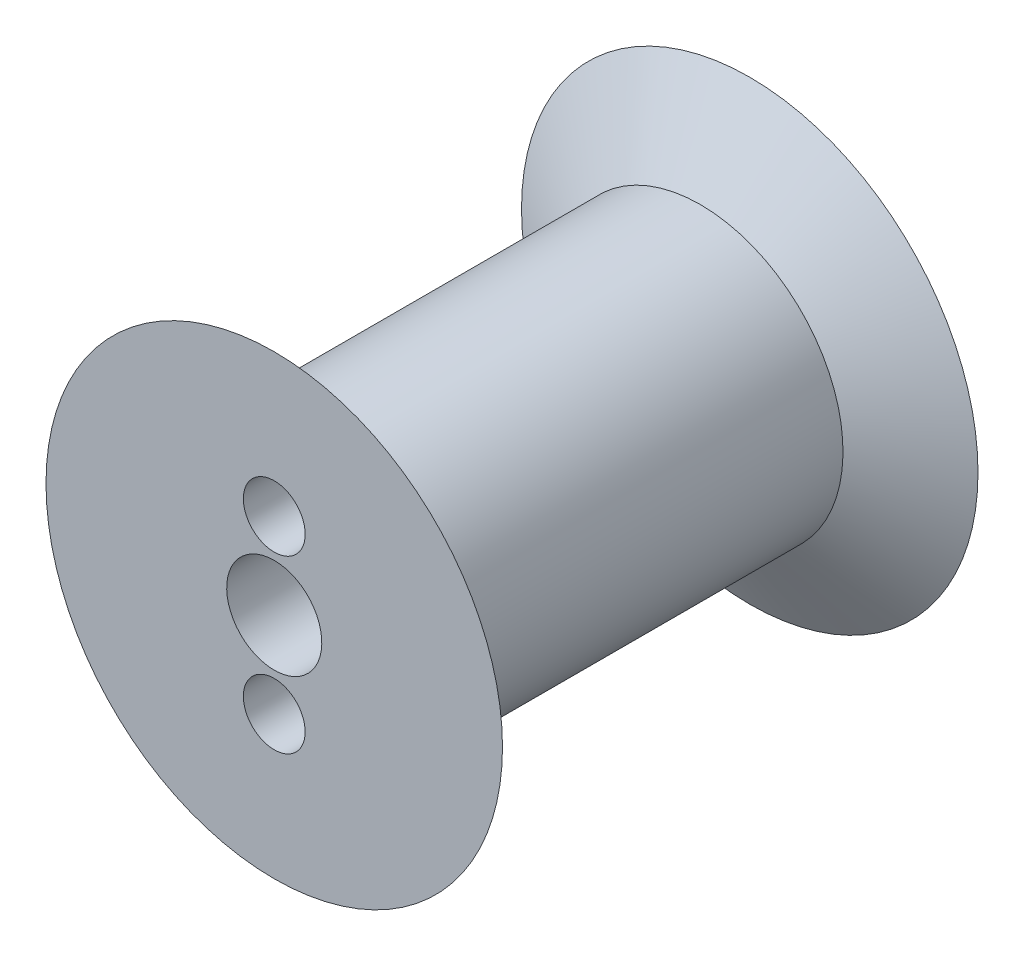
ISO-10303-21;
HEADER;
FILE_DESCRIPTION(('STEP AP214'),'2;1');
FILE_NAME('part.step','',(''),(''),'','','');
FILE_SCHEMA(('AUTOMOTIVE_DESIGN { 1 0 10303 214 1 1 1 1 }'));
ENDSEC;
DATA;
#1=APPLICATION_CONTEXT('core data for automotive mechanical design processes');
#2=APPLICATION_PROTOCOL_DEFINITION('international standard','automotive_design',2000,#1);
#3=PRODUCT_CONTEXT('',#1,'mechanical');
#4=PRODUCT('Part','Part','',(#3));
#5=PRODUCT_RELATED_PRODUCT_CATEGORY('part','',(#4));
#6=PRODUCT_DEFINITION_FORMATION('','',#4);
#7=PRODUCT_DEFINITION_CONTEXT('part definition',#1,'design');
#8=PRODUCT_DEFINITION('design','',#6,#7);
#9=PRODUCT_DEFINITION_SHAPE('','',#8);
#10=(LENGTH_UNIT() NAMED_UNIT(*) SI_UNIT(.MILLI.,.METRE.));
#11=(NAMED_UNIT(*) PLANE_ANGLE_UNIT() SI_UNIT($,.RADIAN.));
#12=(NAMED_UNIT(*) SI_UNIT($,.STERADIAN.) SOLID_ANGLE_UNIT());
#13=UNCERTAINTY_MEASURE_WITH_UNIT(LENGTH_MEASURE(1.E-05),#10,'distance_accuracy_value','');
#14=(GEOMETRIC_REPRESENTATION_CONTEXT(3) GLOBAL_UNCERTAINTY_ASSIGNED_CONTEXT((#13)) GLOBAL_UNIT_ASSIGNED_CONTEXT((#10,
#11,#12)) REPRESENTATION_CONTEXT('',''));
#15=CARTESIAN_POINT('',(0.,0.,0.));
#16=DIRECTION('',(0.,0.,1.));
#17=DIRECTION('',(1.,0.,0.));
#18=AXIS2_PLACEMENT_3D('',#15,#16,#17);
#19=CARTESIAN_POINT('',(-24.,-3.40005076182853E-13,0.));
#20=DIRECTION('',(0.,0.,1.));
#21=DIRECTION('',(0.,-1.,0.));
#22=AXIS2_PLACEMENT_3D('',#19,#20,#21);
#23=PLANE('',#22);
#24=CARTESIAN_POINT('',(0.,-8.99999999999995,0.));
#25=DIRECTION('',(0.,0.,1.));
#26=DIRECTION('',(0.,-1.,0.));
#27=AXIS2_PLACEMENT_3D('',#24,#25,#26);
#28=CIRCLE('',#27,1.69999999999999);
#29=CARTESIAN_POINT('',(0.,-10.6999999999999,0.));
#30=VERTEX_POINT('',#29);
#31=EDGE_CURVE('E68',#30,#30,#28,.T.);
#32=ORIENTED_EDGE('',*,*,#31,.T.);
#33=EDGE_LOOP('',(#32));
#34=FACE_BOUND('',#33,.T.);
#35=CARTESIAN_POINT('',(0.,8.99999999999995,0.));
#36=DIRECTION('',(0.,0.,1.));
#37=DIRECTION('',(0.,-1.,0.));
#38=AXIS2_PLACEMENT_3D('',#35,#36,#37);
#39=CIRCLE('',#38,1.69999999999999);
#40=CARTESIAN_POINT('',(0.,7.29999999999996,0.));
#41=VERTEX_POINT('',#40);
#42=EDGE_CURVE('E56',#41,#41,#39,.T.);
#43=ORIENTED_EDGE('',*,*,#42,.T.);
#44=EDGE_LOOP('',(#43));
#45=FACE_BOUND('',#44,.T.);
#46=CARTESIAN_POINT('',(0.,0.,0.));
#47=DIRECTION('',(0.,0.,-1.));
#48=DIRECTION('',(0.,1.,0.));
#49=AXIS2_PLACEMENT_3D('',#46,#47,#48);
#50=CIRCLE('',#49,5.00000000000006);
#51=CARTESIAN_POINT('',(0.,5.00000000000006,0.));
#52=VERTEX_POINT('',#51);
#53=EDGE_CURVE('E10',#52,#52,#50,.T.);
#54=ORIENTED_EDGE('',*,*,#53,.F.);
#55=EDGE_LOOP('',(#54));
#56=FACE_BOUND('',#55,.T.);
#57=CARTESIAN_POINT('',(0.,0.,0.));
#58=DIRECTION('',(0.,0.,-1.));
#59=DIRECTION('',(0.,1.,0.));
#60=AXIS2_PLACEMENT_3D('',#57,#58,#59);
#61=CIRCLE('',#60,24.0000000000001);
#62=CARTESIAN_POINT('',(0.,24.0000000000001,0.));
#63=VERTEX_POINT('',#62);
#64=EDGE_CURVE('E53',#63,#63,#61,.T.);
#65=ORIENTED_EDGE('',*,*,#64,.T.);
#66=EDGE_LOOP('',(#65));
#67=FACE_BOUND('',#66,.T.);
#68=ADVANCED_FACE('F31',(#34,#45,#56,#67),#23,.F.);
#69=CARTESIAN_POINT('',(0.,0.,0.));
#70=DIRECTION('',(0.,0.,-1.));
#71=DIRECTION('',(0.,1.,0.));
#72=AXIS2_PLACEMENT_3D('',#69,#70,#71);
#73=CYLINDRICAL_SURFACE('',#72,5.00000000000006);
#74=CARTESIAN_POINT('',(0.,0.,50.));
#75=DIRECTION('',(0.,0.,-1.));
#76=DIRECTION('',(0.,1.,0.));
#77=AXIS2_PLACEMENT_3D('',#74,#75,#76);
#78=CIRCLE('',#77,5.00000000000006);
#79=CARTESIAN_POINT('',(0.,5.00000000000006,50.));
#80=VERTEX_POINT('',#79);
#81=EDGE_CURVE('E37',#80,#80,#78,.T.);
#82=ORIENTED_EDGE('',*,*,#81,.F.);
#83=EDGE_LOOP('',(#82));
#84=FACE_BOUND('',#83,.T.);
#85=ORIENTED_EDGE('',*,*,#53,.T.);
#86=EDGE_LOOP('',(#85));
#87=FACE_BOUND('',#86,.T.);
#88=ADVANCED_FACE('F87',(#84,#87),#73,.F.);
#89=CARTESIAN_POINT('',(-5.00000000000001,0.,50.));
#90=DIRECTION('',(0.,0.,-1.));
#91=DIRECTION('',(0.,1.,0.));
#92=AXIS2_PLACEMENT_3D('',#89,#90,#91);
#93=PLANE('',#92);
#94=CARTESIAN_POINT('',(0.,-8.99999999999995,50.));
#95=DIRECTION('',(0.,0.,1.));
#96=DIRECTION('',(1.,0.,0.));
#97=AXIS2_PLACEMENT_3D('',#94,#95,#96);
#98=CIRCLE('',#97,3.25);
#99=CARTESIAN_POINT('',(3.24999999999999,-8.99999999999995,50.));
#100=VERTEX_POINT('',#99);
#101=EDGE_CURVE('E77',#100,#100,#98,.T.);
#102=ORIENTED_EDGE('',*,*,#101,.F.);
#103=EDGE_LOOP('',(#102));
#104=FACE_BOUND('',#103,.T.);
#105=CARTESIAN_POINT('',(0.,8.99999999999995,50.));
#106=DIRECTION('',(0.,0.,1.));
#107=DIRECTION('',(1.,0.,0.));
#108=AXIS2_PLACEMENT_3D('',#105,#106,#107);
#109=CIRCLE('',#108,3.25);
#110=CARTESIAN_POINT('',(3.24999999999999,8.99999999999995,50.));
#111=VERTEX_POINT('',#110);
#112=EDGE_CURVE('E65',#111,#111,#109,.T.);
#113=ORIENTED_EDGE('',*,*,#112,.F.);
#114=EDGE_LOOP('',(#113));
#115=FACE_BOUND('',#114,.T.);
#116=CARTESIAN_POINT('',(0.,0.,50.));
#117=DIRECTION('',(0.,0.,-1.));
#118=DIRECTION('',(0.,1.,0.));
#119=AXIS2_PLACEMENT_3D('',#116,#117,#118);
#120=CIRCLE('',#119,24.0000000000001);
#121=CARTESIAN_POINT('',(0.,24.0000000000001,50.));
#122=VERTEX_POINT('',#121);
#123=EDGE_CURVE('E41',#122,#122,#120,.T.);
#124=ORIENTED_EDGE('',*,*,#123,.F.);
#125=EDGE_LOOP('',(#124));
#126=FACE_BOUND('',#125,.T.);
#127=ORIENTED_EDGE('',*,*,#81,.T.);
#128=EDGE_LOOP('',(#127));
#129=FACE_BOUND('',#128,.T.);
#130=ADVANCED_FACE('F83',(#104,#115,#126,#129),#93,.F.);
#131=CARTESIAN_POINT('',(0.,0.,50.));
#132=DIRECTION('',(0.,0.,1.));
#133=DIRECTION('',(0.,-1.,0.));
#134=AXIS2_PLACEMENT_3D('',#131,#132,#133);
#135=CONICAL_SURFACE('',#134,24.0000000000001,1.0471975511966);
#136=CARTESIAN_POINT('',(0.,0.,44.8038475772934));
#137=DIRECTION('',(0.,0.,-1.));
#138=DIRECTION('',(0.,1.,0.));
#139=AXIS2_PLACEMENT_3D('',#136,#137,#138);
#140=CIRCLE('',#139,15.0000000000001);
#141=CARTESIAN_POINT('',(0.,15.0000000000001,44.8038475772934));
#142=VERTEX_POINT('',#141);
#143=EDGE_CURVE('E45',#142,#142,#140,.T.);
#144=ORIENTED_EDGE('',*,*,#143,.F.);
#145=EDGE_LOOP('',(#144));
#146=FACE_BOUND('',#145,.T.);
#147=ORIENTED_EDGE('',*,*,#123,.T.);
#148=EDGE_LOOP('',(#147));
#149=FACE_BOUND('',#148,.T.);
#150=ADVANCED_FACE('F86',(#146,#149),#135,.T.);
#151=CARTESIAN_POINT('',(0.,0.,0.));
#152=DIRECTION('',(0.,0.,-1.));
#153=DIRECTION('',(0.,1.,0.));
#154=AXIS2_PLACEMENT_3D('',#151,#152,#153);
#155=CYLINDRICAL_SURFACE('',#154,15.0000000000001);
#156=CARTESIAN_POINT('',(0.,0.,5.19615242270656));
#157=DIRECTION('',(0.,0.,-1.));
#158=DIRECTION('',(0.,1.,0.));
#159=AXIS2_PLACEMENT_3D('',#156,#157,#158);
#160=CIRCLE('',#159,15.0000000000001);
#161=CARTESIAN_POINT('',(0.,15.0000000000001,5.19615242270656));
#162=VERTEX_POINT('',#161);
#163=EDGE_CURVE('E50',#162,#162,#160,.T.);
#164=ORIENTED_EDGE('',*,*,#163,.F.);
#165=EDGE_LOOP('',(#164));
#166=FACE_BOUND('',#165,.T.);
#167=ORIENTED_EDGE('',*,*,#143,.T.);
#168=EDGE_LOOP('',(#167));
#169=FACE_BOUND('',#168,.T.);
#170=ADVANCED_FACE('F94',(#166,#169),#155,.T.);
#171=CARTESIAN_POINT('',(0.,0.,5.19615242270656));
#172=DIRECTION('',(0.,0.,-1.));
#173=DIRECTION('',(0.,1.,0.));
#174=AXIS2_PLACEMENT_3D('',#171,#172,#173);
#175=CONICAL_SURFACE('',#174,15.0000000000001,1.0471975511966);
#176=ORIENTED_EDGE('',*,*,#64,.F.);
#177=EDGE_LOOP('',(#176));
#178=FACE_BOUND('',#177,.T.);
#179=ORIENTED_EDGE('',*,*,#163,.T.);
#180=EDGE_LOOP('',(#179));
#181=FACE_BOUND('',#180,.T.);
#182=ADVANCED_FACE('F100',(#178,#181),#175,.T.);
#183=CARTESIAN_POINT('',(0.,8.99999999999995,50.));
#184=DIRECTION('',(0.,0.,1.));
#185=DIRECTION('',(1.,0.,0.));
#186=AXIS2_PLACEMENT_3D('',#183,#184,#185);
#187=CYLINDRICAL_SURFACE('',#186,1.69999999999999);
#188=ORIENTED_EDGE('',*,*,#42,.F.);
#189=EDGE_LOOP('',(#188));
#190=FACE_BOUND('',#189,.T.);
#191=CARTESIAN_POINT('',(0.,8.99999999999995,10.));
#192=DIRECTION('',(0.,0.,1.));
#193=DIRECTION('',(1.,0.,0.));
#194=AXIS2_PLACEMENT_3D('',#191,#192,#193);
#195=CIRCLE('',#194,1.69999999999999);
#196=CARTESIAN_POINT('',(1.69999999999998,8.99999999999995,10.));
#197=VERTEX_POINT('',#196);
#198=EDGE_CURVE('E59',#197,#197,#195,.T.);
#199=ORIENTED_EDGE('',*,*,#198,.T.);
#200=EDGE_LOOP('',(#199));
#201=FACE_BOUND('',#200,.T.);
#202=ADVANCED_FACE('F119',(#190,#201),#187,.F.);
#203=CARTESIAN_POINT('',(1.69999999999998,8.99999999999995,10.));
#204=DIRECTION('',(0.,0.,-1.));
#205=DIRECTION('',(-1.,0.,0.));
#206=AXIS2_PLACEMENT_3D('',#203,#204,#205);
#207=PLANE('',#206);
#208=ORIENTED_EDGE('',*,*,#198,.F.);
#209=EDGE_LOOP('',(#208));
#210=FACE_BOUND('',#209,.T.);
#211=CARTESIAN_POINT('',(0.,8.99999999999995,10.));
#212=DIRECTION('',(0.,0.,1.));
#213=DIRECTION('',(1.,0.,0.));
#214=AXIS2_PLACEMENT_3D('',#211,#212,#213);
#215=CIRCLE('',#214,3.24999999999999);
#216=CARTESIAN_POINT('',(3.24999999999998,8.99999999999995,10.));
#217=VERTEX_POINT('',#216);
#218=EDGE_CURVE('E62',#217,#217,#215,.T.);
#219=ORIENTED_EDGE('',*,*,#218,.T.);
#220=EDGE_LOOP('',(#219));
#221=FACE_BOUND('',#220,.T.);
#222=ADVANCED_FACE('F126',(#210,#221),#207,.F.);
#223=CARTESIAN_POINT('',(0.,8.99999999999995,50.));
#224=DIRECTION('',(0.,0.,1.));
#225=DIRECTION('',(1.,0.,0.));
#226=AXIS2_PLACEMENT_3D('',#223,#224,#225);
#227=CYLINDRICAL_SURFACE('',#226,3.25);
#228=ORIENTED_EDGE('',*,*,#218,.F.);
#229=EDGE_LOOP('',(#228));
#230=FACE_BOUND('',#229,.T.);
#231=ORIENTED_EDGE('',*,*,#112,.T.);
#232=EDGE_LOOP('',(#231));
#233=FACE_BOUND('',#232,.T.);
#234=ADVANCED_FACE('F132',(#230,#233),#227,.F.);
#235=CARTESIAN_POINT('',(0.,-8.99999999999995,50.));
#236=DIRECTION('',(0.,0.,1.));
#237=DIRECTION('',(1.,0.,0.));
#238=AXIS2_PLACEMENT_3D('',#235,#236,#237);
#239=CYLINDRICAL_SURFACE('',#238,1.69999999999999);
#240=ORIENTED_EDGE('',*,*,#31,.F.);
#241=EDGE_LOOP('',(#240));
#242=FACE_BOUND('',#241,.T.);
#243=CARTESIAN_POINT('',(0.,-8.99999999999995,10.));
#244=DIRECTION('',(0.,0.,1.));
#245=DIRECTION('',(1.,0.,0.));
#246=AXIS2_PLACEMENT_3D('',#243,#244,#245);
#247=CIRCLE('',#246,1.69999999999999);
#248=CARTESIAN_POINT('',(1.69999999999998,-8.99999999999995,10.));
#249=VERTEX_POINT('',#248);
#250=EDGE_CURVE('E71',#249,#249,#247,.T.);
#251=ORIENTED_EDGE('',*,*,#250,.T.);
#252=EDGE_LOOP('',(#251));
#253=FACE_BOUND('',#252,.T.);
#254=ADVANCED_FACE('F136',(#242,#253),#239,.F.);
#255=CARTESIAN_POINT('',(1.69999999999998,-8.99999999999995,10.));
#256=DIRECTION('',(0.,0.,-1.));
#257=DIRECTION('',(-1.,0.,0.));
#258=AXIS2_PLACEMENT_3D('',#255,#256,#257);
#259=PLANE('',#258);
#260=ORIENTED_EDGE('',*,*,#250,.F.);
#261=EDGE_LOOP('',(#260));
#262=FACE_BOUND('',#261,.T.);
#263=CARTESIAN_POINT('',(0.,-8.99999999999995,10.));
#264=DIRECTION('',(0.,0.,1.));
#265=DIRECTION('',(1.,0.,0.));
#266=AXIS2_PLACEMENT_3D('',#263,#264,#265);
#267=CIRCLE('',#266,3.24999999999999);
#268=CARTESIAN_POINT('',(3.24999999999998,-8.99999999999995,10.));
#269=VERTEX_POINT('',#268);
#270=EDGE_CURVE('E74',#269,#269,#267,.T.);
#271=ORIENTED_EDGE('',*,*,#270,.T.);
#272=EDGE_LOOP('',(#271));
#273=FACE_BOUND('',#272,.T.);
#274=ADVANCED_FACE('F140',(#262,#273),#259,.F.);
#275=CARTESIAN_POINT('',(0.,-8.99999999999995,50.));
#276=DIRECTION('',(0.,0.,1.));
#277=DIRECTION('',(1.,0.,0.));
#278=AXIS2_PLACEMENT_3D('',#275,#276,#277);
#279=CYLINDRICAL_SURFACE('',#278,3.25);
#280=ORIENTED_EDGE('',*,*,#270,.F.);
#281=EDGE_LOOP('',(#280));
#282=FACE_BOUND('',#281,.T.);
#283=ORIENTED_EDGE('',*,*,#101,.T.);
#284=EDGE_LOOP('',(#283));
#285=FACE_BOUND('',#284,.T.);
#286=ADVANCED_FACE('F81',(#282,#285),#279,.F.);
#287=CLOSED_SHELL('',(#68,#88,#130,#150,#170,#182,#202,#222,#234,#254,#274,#286));
#288=MANIFOLD_SOLID_BREP('B2',#287);
#289=ADVANCED_BREP_SHAPE_REPRESENTATION('',(#18,#288),#14);
#290=SHAPE_DEFINITION_REPRESENTATION(#9,#289);
ENDSEC;
END-ISO-10303-21;
